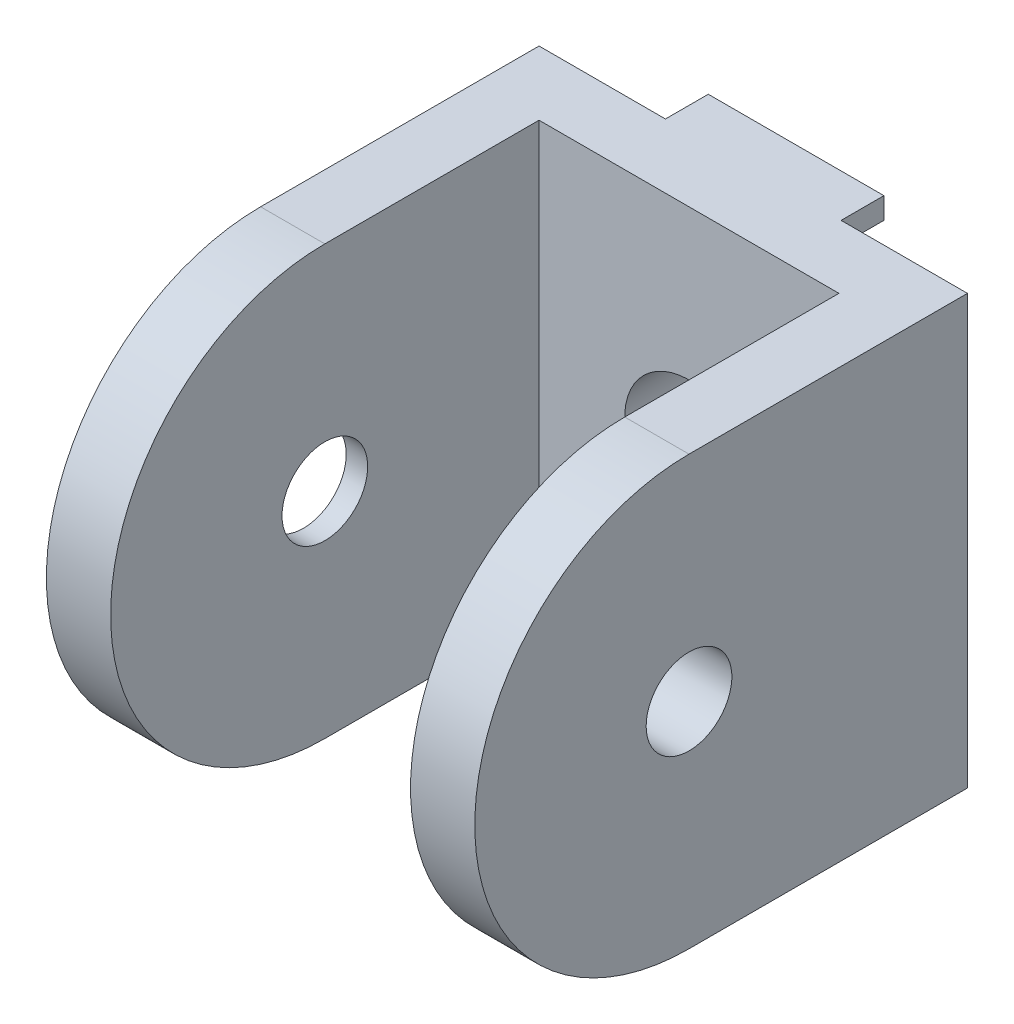
ISO-10303-21;
HEADER;
FILE_DESCRIPTION(('STEP AP214'),'2;1');
FILE_NAME('part.step','',(''),(''),'','','');
FILE_SCHEMA(('AUTOMOTIVE_DESIGN { 1 0 10303 214 1 1 1 1 }'));
ENDSEC;
DATA;
#1=APPLICATION_CONTEXT('core data for automotive mechanical design processes');
#2=APPLICATION_PROTOCOL_DEFINITION('international standard','automotive_design',2000,#1);
#3=PRODUCT_CONTEXT('',#1,'mechanical');
#4=PRODUCT('Part','Part','',(#3));
#5=PRODUCT_RELATED_PRODUCT_CATEGORY('part','',(#4));
#6=PRODUCT_DEFINITION_FORMATION('','',#4);
#7=PRODUCT_DEFINITION_CONTEXT('part definition',#1,'design');
#8=PRODUCT_DEFINITION('design','',#6,#7);
#9=PRODUCT_DEFINITION_SHAPE('','',#8);
#10=(LENGTH_UNIT() NAMED_UNIT(*) SI_UNIT(.MILLI.,.METRE.));
#11=(NAMED_UNIT(*) PLANE_ANGLE_UNIT() SI_UNIT($,.RADIAN.));
#12=(NAMED_UNIT(*) SI_UNIT($,.STERADIAN.) SOLID_ANGLE_UNIT());
#13=UNCERTAINTY_MEASURE_WITH_UNIT(LENGTH_MEASURE(1.E-05),#10,'distance_accuracy_value','');
#14=(GEOMETRIC_REPRESENTATION_CONTEXT(3) GLOBAL_UNCERTAINTY_ASSIGNED_CONTEXT((#13)) GLOBAL_UNIT_ASSIGNED_CONTEXT((#10,
#11,#12)) REPRESENTATION_CONTEXT('',''));
#15=CARTESIAN_POINT('',(0.,0.,0.));
#16=DIRECTION('',(0.,0.,1.));
#17=DIRECTION('',(1.,0.,0.));
#18=AXIS2_PLACEMENT_3D('',#15,#16,#17);
#19=CARTESIAN_POINT('',(10.,10.,0.));
#20=DIRECTION('',(0.,0.,-1.));
#21=DIRECTION('',(-1.,0.,0.));
#22=AXIS2_PLACEMENT_3D('',#19,#20,#21);
#23=PLANE('',#22);
#24=CARTESIAN_POINT('',(0.,0.,0.));
#25=DIRECTION('',(0.,0.,1.));
#26=DIRECTION('',(1.,0.,0.));
#27=AXIS2_PLACEMENT_3D('',#24,#25,#26);
#28=CIRCLE('',#27,3.);
#29=CARTESIAN_POINT('',(3.,0.,0.));
#30=VERTEX_POINT('',#29);
#31=EDGE_CURVE('E277',#30,#30,#28,.T.);
#32=ORIENTED_EDGE('',*,*,#31,.T.);
#33=EDGE_LOOP('',(#32));
#34=FACE_BOUND('',#33,.T.);
#35=DIRECTION('',(1.,0.,0.));
#36=VECTOR('',#35,1.);
#37=CARTESIAN_POINT('',(4.1,-9.,0.));
#38=LINE('',#37,#36);
#39=CARTESIAN_POINT('',(-4.1,-9.,0.));
#40=VERTEX_POINT('',#39);
#41=CARTESIAN_POINT('',(4.1,-9.,0.));
#42=VERTEX_POINT('',#41);
#43=EDGE_CURVE('E338',#40,#42,#38,.T.);
#44=ORIENTED_EDGE('',*,*,#43,.F.);
#45=DIRECTION('',(0.,1.,0.));
#46=VECTOR('',#45,1.);
#47=CARTESIAN_POINT('',(-4.1,-10.,0.));
#48=LINE('',#47,#46);
#49=CARTESIAN_POINT('',(-4.1,-10.,0.));
#50=VERTEX_POINT('',#49);
#51=EDGE_CURVE('E336',#50,#40,#48,.T.);
#52=ORIENTED_EDGE('',*,*,#51,.F.);
#53=DIRECTION('',(1.,0.,0.));
#54=VECTOR('',#53,1.);
#55=CARTESIAN_POINT('',(-10.,-10.,0.));
#56=LINE('',#55,#54);
#57=CARTESIAN_POINT('',(-10.,-10.,0.));
#58=VERTEX_POINT('',#57);
#59=EDGE_CURVE('E172',#58,#50,#56,.T.);
#60=ORIENTED_EDGE('',*,*,#59,.F.);
#61=DIRECTION('',(0.,-1.,0.));
#62=VECTOR('',#61,1.);
#63=CARTESIAN_POINT('',(-10.,-10.,0.));
#64=LINE('',#63,#62);
#65=CARTESIAN_POINT('',(-10.,10.,0.));
#66=VERTEX_POINT('',#65);
#67=EDGE_CURVE('E225',#66,#58,#64,.T.);
#68=ORIENTED_EDGE('',*,*,#67,.F.);
#69=DIRECTION('',(-1.,0.,0.));
#70=VECTOR('',#69,1.);
#71=CARTESIAN_POINT('',(-10.,10.,0.));
#72=LINE('',#71,#70);
#73=CARTESIAN_POINT('',(-4.1,10.,0.));
#74=VERTEX_POINT('',#73);
#75=EDGE_CURVE('E215',#74,#66,#72,.T.);
#76=ORIENTED_EDGE('',*,*,#75,.F.);
#77=DIRECTION('',(0.,1.,0.));
#78=VECTOR('',#77,1.);
#79=CARTESIAN_POINT('',(-4.1,10.,0.));
#80=LINE('',#79,#78);
#81=CARTESIAN_POINT('',(-4.1,9.,0.));
#82=VERTEX_POINT('',#81);
#83=EDGE_CURVE('E184',#82,#74,#80,.T.);
#84=ORIENTED_EDGE('',*,*,#83,.F.);
#85=DIRECTION('',(-1.,0.,0.));
#86=VECTOR('',#85,1.);
#87=CARTESIAN_POINT('',(4.1,9.,0.));
#88=LINE('',#87,#86);
#89=CARTESIAN_POINT('',(4.1,9.,0.));
#90=VERTEX_POINT('',#89);
#91=EDGE_CURVE('E58',#90,#82,#88,.T.);
#92=ORIENTED_EDGE('',*,*,#91,.F.);
#93=DIRECTION('',(0.,-1.,0.));
#94=VECTOR('',#93,1.);
#95=CARTESIAN_POINT('',(4.1,10.,0.));
#96=LINE('',#95,#94);
#97=CARTESIAN_POINT('',(4.1,10.,0.));
#98=VERTEX_POINT('',#97);
#99=EDGE_CURVE('E173',#98,#90,#96,.T.);
#100=ORIENTED_EDGE('',*,*,#99,.F.);
#101=CARTESIAN_POINT('',(10.,10.,0.));
#102=VERTEX_POINT('',#101);
#103=EDGE_CURVE('E218',#102,#98,#72,.T.);
#104=ORIENTED_EDGE('',*,*,#103,.F.);
#105=DIRECTION('',(0.,1.,0.));
#106=VECTOR('',#105,1.);
#107=CARTESIAN_POINT('',(10.,-10.,0.));
#108=LINE('',#107,#106);
#109=CARTESIAN_POINT('',(10.,-10.,0.));
#110=VERTEX_POINT('',#109);
#111=EDGE_CURVE('E219',#110,#102,#108,.T.);
#112=ORIENTED_EDGE('',*,*,#111,.F.);
#113=CARTESIAN_POINT('',(4.1,-10.,0.));
#114=VERTEX_POINT('',#113);
#115=EDGE_CURVE('E229',#114,#110,#56,.T.);
#116=ORIENTED_EDGE('',*,*,#115,.F.);
#117=DIRECTION('',(0.,-1.,0.));
#118=VECTOR('',#117,1.);
#119=CARTESIAN_POINT('',(4.1,-10.,0.));
#120=LINE('',#119,#118);
#121=EDGE_CURVE('E166',#42,#114,#120,.T.);
#122=ORIENTED_EDGE('',*,*,#121,.F.);
#123=EDGE_LOOP('',(#44,#52,#60,#68,#76,#84,#92,#100,#104,#112,#116,#122));
#124=FACE_BOUND('',#123,.T.);
#125=ADVANCED_FACE('F33',(#34,#124),#23,.T.);
#126=CARTESIAN_POINT('',(10.,0.,13.));
#127=DIRECTION('',(-1.,0.,0.));
#128=DIRECTION('',(0.,0.,1.));
#129=AXIS2_PLACEMENT_3D('',#126,#127,#128);
#130=CYLINDRICAL_SURFACE('',#129,2.);
#131=CARTESIAN_POINT('',(-7.,0.,13.));
#132=DIRECTION('',(-1.,0.,0.));
#133=DIRECTION('',(0.,0.,1.));
#134=AXIS2_PLACEMENT_3D('',#131,#132,#133);
#135=CIRCLE('',#134,2.);
#136=CARTESIAN_POINT('',(-7.,0.,15.));
#137=VERTEX_POINT('',#136);
#138=EDGE_CURVE('E262',#137,#137,#135,.T.);
#139=ORIENTED_EDGE('',*,*,#138,.F.);
#140=EDGE_LOOP('',(#139));
#141=FACE_BOUND('',#140,.T.);
#142=CARTESIAN_POINT('',(-8.,0.,13.));
#143=DIRECTION('',(-1.,0.,0.));
#144=DIRECTION('',(0.,0.,1.));
#145=AXIS2_PLACEMENT_3D('',#142,#143,#144);
#146=CIRCLE('',#145,2.);
#147=CARTESIAN_POINT('',(-8.,0.,15.));
#148=VERTEX_POINT('',#147);
#149=EDGE_CURVE('E264',#148,#148,#146,.F.);
#150=ORIENTED_EDGE('',*,*,#149,.F.);
#151=EDGE_LOOP('',(#150));
#152=FACE_BOUND('',#151,.T.);
#153=ADVANCED_FACE('F380',(#141,#152),#130,.F.);
#154=CARTESIAN_POINT('',(-10.,10.,3.));
#155=DIRECTION('',(0.,-1.,0.));
#156=DIRECTION('',(0.,0.,-1.));
#157=AXIS2_PLACEMENT_3D('',#154,#155,#156);
#158=PLANE('',#157);
#159=DIRECTION('',(1.,0.,0.));
#160=VECTOR('',#159,1.);
#161=CARTESIAN_POINT('',(-76.8194036266836,10.,13.));
#162=LINE('',#161,#160);
#163=CARTESIAN_POINT('',(7.00000000000001,10.,13.));
#164=VERTEX_POINT('',#163);
#165=CARTESIAN_POINT('',(9.99999999999994,10.,13.));
#166=VERTEX_POINT('',#165);
#167=EDGE_CURVE('E286',#164,#166,#162,.T.);
#168=ORIENTED_EDGE('',*,*,#167,.T.);
#169=DIRECTION('',(0.,0.,-1.));
#170=VECTOR('',#169,1.);
#171=CARTESIAN_POINT('',(10.,10.,3.));
#172=LINE('',#171,#170);
#173=EDGE_CURVE('E11',#166,#102,#172,.T.);
#174=ORIENTED_EDGE('',*,*,#173,.T.);
#175=ORIENTED_EDGE('',*,*,#103,.T.);
#176=DIRECTION('',(0.,0.,1.));
#177=VECTOR('',#176,1.);
#178=CARTESIAN_POINT('',(4.1,10.,-2.));
#179=LINE('',#178,#177);
#180=CARTESIAN_POINT('',(4.1,10.,-2.));
#181=VERTEX_POINT('',#180);
#182=EDGE_CURVE('E190',#181,#98,#179,.T.);
#183=ORIENTED_EDGE('',*,*,#182,.F.);
#184=DIRECTION('',(1.,0.,0.));
#185=VECTOR('',#184,1.);
#186=CARTESIAN_POINT('',(4.1,10.,-2.));
#187=LINE('',#186,#185);
#188=CARTESIAN_POINT('',(-4.1,10.,-2.));
#189=VERTEX_POINT('',#188);
#190=EDGE_CURVE('E188',#189,#181,#187,.T.);
#191=ORIENTED_EDGE('',*,*,#190,.F.);
#192=DIRECTION('',(0.,0.,1.));
#193=VECTOR('',#192,1.);
#194=CARTESIAN_POINT('',(-4.1,10.,-2.));
#195=LINE('',#194,#193);
#196=EDGE_CURVE('E201',#189,#74,#195,.T.);
#197=ORIENTED_EDGE('',*,*,#196,.T.);
#198=ORIENTED_EDGE('',*,*,#75,.T.);
#199=DIRECTION('',(0.,0.,-1.));
#200=VECTOR('',#199,1.);
#201=CARTESIAN_POINT('',(-10.,10.,3.));
#202=LINE('',#201,#200);
#203=CARTESIAN_POINT('',(-10.,10.,13.));
#204=VERTEX_POINT('',#203);
#205=EDGE_CURVE('E42',#204,#66,#202,.T.);
#206=ORIENTED_EDGE('',*,*,#205,.F.);
#207=CARTESIAN_POINT('',(-7.00000000000003,10.,13.));
#208=VERTEX_POINT('',#207);
#209=EDGE_CURVE('E289',#204,#208,#162,.T.);
#210=ORIENTED_EDGE('',*,*,#209,.T.);
#211=DIRECTION('',(0.,0.,-1.));
#212=VECTOR('',#211,1.);
#213=CARTESIAN_POINT('',(-7.,10.,23.));
#214=LINE('',#213,#212);
#215=CARTESIAN_POINT('',(-7.,10.,3.));
#216=VERTEX_POINT('',#215);
#217=EDGE_CURVE('E255',#208,#216,#214,.T.);
#218=ORIENTED_EDGE('',*,*,#217,.T.);
#219=DIRECTION('',(-1.,0.,0.));
#220=VECTOR('',#219,1.);
#221=CARTESIAN_POINT('',(-10.,10.,3.));
#222=LINE('',#221,#220);
#223=CARTESIAN_POINT('',(7.,10.,3.));
#224=VERTEX_POINT('',#223);
#225=EDGE_CURVE('E231',#224,#216,#222,.T.);
#226=ORIENTED_EDGE('',*,*,#225,.F.);
#227=DIRECTION('',(0.,0.,-1.));
#228=VECTOR('',#227,1.);
#229=CARTESIAN_POINT('',(7.,10.,23.));
#230=LINE('',#229,#228);
#231=EDGE_CURVE('E305',#164,#224,#230,.T.);
#232=ORIENTED_EDGE('',*,*,#231,.F.);
#233=EDGE_LOOP('',(#168,#174,#175,#183,#191,#197,#198,#206,#210,#218,#226,#232));
#234=FACE_BOUND('',#233,.T.);
#235=ADVANCED_FACE('F324',(#234),#158,.F.);
#236=CARTESIAN_POINT('',(10.,10.,3.));
#237=DIRECTION('',(0.,0.,-1.));
#238=DIRECTION('',(-1.,0.,0.));
#239=AXIS2_PLACEMENT_3D('',#236,#237,#238);
#240=PLANE('',#239);
#241=CARTESIAN_POINT('',(0.,0.,3.));
#242=DIRECTION('',(0.,0.,1.));
#243=DIRECTION('',(1.,0.,0.));
#244=AXIS2_PLACEMENT_3D('',#241,#242,#243);
#245=CIRCLE('',#244,3.);
#246=CARTESIAN_POINT('',(3.,0.,3.));
#247=VERTEX_POINT('',#246);
#248=EDGE_CURVE('E280',#247,#247,#245,.T.);
#249=ORIENTED_EDGE('',*,*,#248,.F.);
#250=EDGE_LOOP('',(#249));
#251=FACE_BOUND('',#250,.T.);
#252=DIRECTION('',(0.,-1.,0.));
#253=VECTOR('',#252,1.);
#254=CARTESIAN_POINT('',(7.,-10.,3.));
#255=LINE('',#254,#253);
#256=CARTESIAN_POINT('',(7.,-10.,3.));
#257=VERTEX_POINT('',#256);
#258=EDGE_CURVE('E301',#224,#257,#255,.T.);
#259=ORIENTED_EDGE('',*,*,#258,.F.);
#260=ORIENTED_EDGE('',*,*,#225,.T.);
#261=DIRECTION('',(0.,1.,0.));
#262=VECTOR('',#261,1.);
#263=CARTESIAN_POINT('',(-7.,-10.,3.));
#264=LINE('',#263,#262);
#265=CARTESIAN_POINT('',(-7.,-10.,3.));
#266=VERTEX_POINT('',#265);
#267=EDGE_CURVE('E242',#266,#216,#264,.T.);
#268=ORIENTED_EDGE('',*,*,#267,.F.);
#269=DIRECTION('',(1.,0.,0.));
#270=VECTOR('',#269,1.);
#271=CARTESIAN_POINT('',(-10.,-10.,3.));
#272=LINE('',#271,#270);
#273=EDGE_CURVE('E236',#266,#257,#272,.T.);
#274=ORIENTED_EDGE('',*,*,#273,.T.);
#275=EDGE_LOOP('',(#259,#260,#268,#274));
#276=FACE_BOUND('',#275,.T.);
#277=ADVANCED_FACE('F317',(#251,#276),#240,.F.);
#278=CARTESIAN_POINT('',(10.,-10.,3.));
#279=DIRECTION('',(-1.,0.,0.));
#280=DIRECTION('',(0.,0.,1.));
#281=AXIS2_PLACEMENT_3D('',#278,#279,#280);
#282=PLANE('',#281);
#283=CARTESIAN_POINT('',(10.,0.,13.));
#284=DIRECTION('',(-1.,0.,0.));
#285=DIRECTION('',(0.,0.,1.));
#286=AXIS2_PLACEMENT_3D('',#283,#284,#285);
#287=CIRCLE('',#286,2.);
#288=CARTESIAN_POINT('',(10.,0.,15.));
#289=VERTEX_POINT('',#288);
#290=EDGE_CURVE('E263',#289,#289,#287,.T.);
#291=ORIENTED_EDGE('',*,*,#290,.T.);
#292=EDGE_LOOP('',(#291));
#293=FACE_BOUND('',#292,.T.);
#294=CARTESIAN_POINT('',(9.99999999999999,0.,13.));
#295=DIRECTION('',(-1.,0.,0.));
#296=DIRECTION('',(0.,0.,1.));
#297=AXIS2_PLACEMENT_3D('',#294,#295,#296);
#298=CIRCLE('',#297,10.);
#299=CARTESIAN_POINT('',(9.99999999999994,-10.,13.));
#300=VERTEX_POINT('',#299);
#301=EDGE_CURVE('E296',#166,#300,#298,.F.);
#302=ORIENTED_EDGE('',*,*,#301,.T.);
#303=DIRECTION('',(0.,0.,-1.));
#304=VECTOR('',#303,1.);
#305=CARTESIAN_POINT('',(10.,-10.,3.));
#306=LINE('',#305,#304);
#307=EDGE_CURVE('E232',#300,#110,#306,.T.);
#308=ORIENTED_EDGE('',*,*,#307,.T.);
#309=ORIENTED_EDGE('',*,*,#111,.T.);
#310=ORIENTED_EDGE('',*,*,#173,.F.);
#311=EDGE_LOOP('',(#302,#308,#309,#310));
#312=FACE_BOUND('',#311,.T.);
#313=ADVANCED_FACE('F35',(#293,#312),#282,.F.);
#314=CARTESIAN_POINT('',(-10.,-10.,3.));
#315=DIRECTION('',(1.,0.,0.));
#316=DIRECTION('',(0.,0.,-1.));
#317=AXIS2_PLACEMENT_3D('',#314,#315,#316);
#318=PLANE('',#317);
#319=CARTESIAN_POINT('',(-10.,0.,13.));
#320=DIRECTION('',(-1.,0.,0.));
#321=DIRECTION('',(0.,0.,1.));
#322=AXIS2_PLACEMENT_3D('',#319,#320,#321);
#323=CIRCLE('',#322,5.);
#324=CARTESIAN_POINT('',(-10.,0.,18.));
#325=VERTEX_POINT('',#324);
#326=EDGE_CURVE('E272',#325,#325,#323,.T.);
#327=ORIENTED_EDGE('',*,*,#326,.F.);
#328=EDGE_LOOP('',(#327));
#329=FACE_BOUND('',#328,.T.);
#330=DIRECTION('',(0.,0.,-1.));
#331=VECTOR('',#330,1.);
#332=CARTESIAN_POINT('',(-10.,-10.,3.));
#333=LINE('',#332,#331);
#334=CARTESIAN_POINT('',(-10.,-10.,13.));
#335=VERTEX_POINT('',#334);
#336=EDGE_CURVE('E235',#335,#58,#333,.T.);
#337=ORIENTED_EDGE('',*,*,#336,.F.);
#338=CARTESIAN_POINT('',(-9.99999999999999,0.,13.));
#339=DIRECTION('',(1.,0.,0.));
#340=DIRECTION('',(0.,0.,-1.));
#341=AXIS2_PLACEMENT_3D('',#338,#339,#340);
#342=CIRCLE('',#341,10.);
#343=EDGE_CURVE('E299',#335,#204,#342,.F.);
#344=ORIENTED_EDGE('',*,*,#343,.T.);
#345=ORIENTED_EDGE('',*,*,#205,.T.);
#346=ORIENTED_EDGE('',*,*,#67,.T.);
#347=EDGE_LOOP('',(#337,#344,#345,#346));
#348=FACE_BOUND('',#347,.T.);
#349=ADVANCED_FACE('F333',(#329,#348),#318,.F.);
#350=CARTESIAN_POINT('',(-10.,-10.,3.));
#351=DIRECTION('',(0.,1.,0.));
#352=DIRECTION('',(0.,0.,1.));
#353=AXIS2_PLACEMENT_3D('',#350,#351,#352);
#354=PLANE('',#353);
#355=ORIENTED_EDGE('',*,*,#307,.F.);
#356=DIRECTION('',(1.,0.,0.));
#357=VECTOR('',#356,1.);
#358=CARTESIAN_POINT('',(-76.8194036266836,-10.,13.));
#359=LINE('',#358,#357);
#360=CARTESIAN_POINT('',(6.99999999999998,-10.,13.));
#361=VERTEX_POINT('',#360);
#362=EDGE_CURVE('E285',#361,#300,#359,.T.);
#363=ORIENTED_EDGE('',*,*,#362,.F.);
#364=DIRECTION('',(0.,0.,-1.));
#365=VECTOR('',#364,1.);
#366=CARTESIAN_POINT('',(7.,-10.,23.));
#367=LINE('',#366,#365);
#368=EDGE_CURVE('E304',#361,#257,#367,.T.);
#369=ORIENTED_EDGE('',*,*,#368,.T.);
#370=ORIENTED_EDGE('',*,*,#273,.F.);
#371=DIRECTION('',(0.,0.,-1.));
#372=VECTOR('',#371,1.);
#373=CARTESIAN_POINT('',(-7.,-10.,23.));
#374=LINE('',#373,#372);
#375=CARTESIAN_POINT('',(-7.00000000000003,-10.,13.));
#376=VERTEX_POINT('',#375);
#377=EDGE_CURVE('E257',#376,#266,#374,.T.);
#378=ORIENTED_EDGE('',*,*,#377,.F.);
#379=EDGE_CURVE('E290',#335,#376,#359,.T.);
#380=ORIENTED_EDGE('',*,*,#379,.F.);
#381=ORIENTED_EDGE('',*,*,#336,.T.);
#382=ORIENTED_EDGE('',*,*,#59,.T.);
#383=DIRECTION('',(0.,0.,1.));
#384=VECTOR('',#383,1.);
#385=CARTESIAN_POINT('',(-4.1,-10.,-2.));
#386=LINE('',#385,#384);
#387=CARTESIAN_POINT('',(-4.1,-10.,-2.));
#388=VERTEX_POINT('',#387);
#389=EDGE_CURVE('E151',#388,#50,#386,.T.);
#390=ORIENTED_EDGE('',*,*,#389,.F.);
#391=DIRECTION('',(-1.,0.,0.));
#392=VECTOR('',#391,1.);
#393=CARTESIAN_POINT('',(4.1,-10.,-2.));
#394=LINE('',#393,#392);
#395=CARTESIAN_POINT('',(4.1,-10.,-2.));
#396=VERTEX_POINT('',#395);
#397=EDGE_CURVE('E158',#396,#388,#394,.T.);
#398=ORIENTED_EDGE('',*,*,#397,.F.);
#399=DIRECTION('',(0.,0.,1.));
#400=VECTOR('',#399,1.);
#401=CARTESIAN_POINT('',(4.1,-10.,-2.));
#402=LINE('',#401,#400);
#403=EDGE_CURVE('E345',#396,#114,#402,.T.);
#404=ORIENTED_EDGE('',*,*,#403,.T.);
#405=ORIENTED_EDGE('',*,*,#115,.T.);
#406=EDGE_LOOP('',(#355,#363,#369,#370,#378,#380,#381,#382,#390,#398,#404,#405));
#407=FACE_BOUND('',#406,.T.);
#408=ADVANCED_FACE('F170',(#407),#354,.F.);
#409=CARTESIAN_POINT('',(-7.,-10.,23.));
#410=DIRECTION('',(-1.,0.,0.));
#411=DIRECTION('',(0.,0.,1.));
#412=AXIS2_PLACEMENT_3D('',#409,#410,#411);
#413=PLANE('',#412);
#414=ORIENTED_EDGE('',*,*,#138,.T.);
#415=EDGE_LOOP('',(#414));
#416=FACE_BOUND('',#415,.T.);
#417=CARTESIAN_POINT('',(-7.00000000000001,0.,13.));
#418=DIRECTION('',(-1.,0.,0.));
#419=DIRECTION('',(0.,0.,1.));
#420=AXIS2_PLACEMENT_3D('',#417,#418,#419);
#421=CIRCLE('',#420,10.);
#422=EDGE_CURVE('E295',#208,#376,#421,.F.);
#423=ORIENTED_EDGE('',*,*,#422,.T.);
#424=ORIENTED_EDGE('',*,*,#377,.T.);
#425=ORIENTED_EDGE('',*,*,#267,.T.);
#426=ORIENTED_EDGE('',*,*,#217,.F.);
#427=EDGE_LOOP('',(#423,#424,#425,#426));
#428=FACE_BOUND('',#427,.T.);
#429=ADVANCED_FACE('F313',(#416,#428),#413,.F.);
#430=CARTESIAN_POINT('',(7.,-10.,23.));
#431=DIRECTION('',(1.,0.,0.));
#432=DIRECTION('',(0.,0.,-1.));
#433=AXIS2_PLACEMENT_3D('',#430,#431,#432);
#434=PLANE('',#433);
#435=CARTESIAN_POINT('',(7.,0.,13.));
#436=DIRECTION('',(1.,0.,0.));
#437=DIRECTION('',(0.,0.,-1.));
#438=AXIS2_PLACEMENT_3D('',#435,#436,#437);
#439=CIRCLE('',#438,2.);
#440=CARTESIAN_POINT('',(7.,0.,11.));
#441=VERTEX_POINT('',#440);
#442=EDGE_CURVE('E260',#441,#441,#439,.T.);
#443=ORIENTED_EDGE('',*,*,#442,.T.);
#444=EDGE_LOOP('',(#443));
#445=FACE_BOUND('',#444,.T.);
#446=ORIENTED_EDGE('',*,*,#368,.F.);
#447=CARTESIAN_POINT('',(7.00000000000001,0.,13.));
#448=DIRECTION('',(1.,0.,0.));
#449=DIRECTION('',(0.,0.,-1.));
#450=AXIS2_PLACEMENT_3D('',#447,#448,#449);
#451=CIRCLE('',#450,10.);
#452=EDGE_CURVE('E293',#361,#164,#451,.F.);
#453=ORIENTED_EDGE('',*,*,#452,.T.);
#454=ORIENTED_EDGE('',*,*,#231,.T.);
#455=ORIENTED_EDGE('',*,*,#258,.T.);
#456=EDGE_LOOP('',(#446,#453,#454,#455));
#457=FACE_BOUND('',#456,.T.);
#458=ADVANCED_FACE('F322',(#445,#457),#434,.F.);
#459=CARTESIAN_POINT('',(-76.8194036266836,0.,13.));
#460=DIRECTION('',(1.,0.,0.));
#461=DIRECTION('',(0.,0.,-1.));
#462=AXIS2_PLACEMENT_3D('',#459,#460,#461);
#463=CYLINDRICAL_SURFACE('',#462,10.);
#464=ORIENTED_EDGE('',*,*,#362,.T.);
#465=ORIENTED_EDGE('',*,*,#301,.F.);
#466=ORIENTED_EDGE('',*,*,#167,.F.);
#467=ORIENTED_EDGE('',*,*,#452,.F.);
#468=EDGE_LOOP('',(#464,#465,#466,#467));
#469=FACE_BOUND('',#468,.T.);
#470=ADVANCED_FACE('F356',(#469),#463,.T.);
#471=ORIENTED_EDGE('',*,*,#343,.F.);
#472=ORIENTED_EDGE('',*,*,#379,.T.);
#473=ORIENTED_EDGE('',*,*,#422,.F.);
#474=ORIENTED_EDGE('',*,*,#209,.F.);
#475=EDGE_LOOP('',(#471,#472,#473,#474));
#476=FACE_BOUND('',#475,.T.);
#477=ADVANCED_FACE('F329',(#476),#463,.T.);
#478=ORIENTED_EDGE('',*,*,#290,.F.);
#479=EDGE_LOOP('',(#478));
#480=FACE_BOUND('',#479,.T.);
#481=ORIENTED_EDGE('',*,*,#442,.F.);
#482=EDGE_LOOP('',(#481));
#483=FACE_BOUND('',#482,.T.);
#484=ADVANCED_FACE('F389',(#480,#483),#130,.F.);
#485=CARTESIAN_POINT('',(-8.,0.,13.));
#486=DIRECTION('',(-1.,0.,0.));
#487=DIRECTION('',(0.,0.,1.));
#488=AXIS2_PLACEMENT_3D('',#485,#486,#487);
#489=PLANE('',#488);
#490=CARTESIAN_POINT('',(-8.,0.,13.));
#491=DIRECTION('',(-1.,0.,0.));
#492=DIRECTION('',(0.,0.,1.));
#493=AXIS2_PLACEMENT_3D('',#490,#491,#492);
#494=CIRCLE('',#493,5.);
#495=CARTESIAN_POINT('',(-8.,0.,18.));
#496=VERTEX_POINT('',#495);
#497=EDGE_CURVE('E266',#496,#496,#494,.T.);
#498=ORIENTED_EDGE('',*,*,#497,.T.);
#499=EDGE_LOOP('',(#498));
#500=FACE_BOUND('',#499,.T.);
#501=ORIENTED_EDGE('',*,*,#149,.T.);
#502=EDGE_LOOP('',(#501));
#503=FACE_BOUND('',#502,.T.);
#504=ADVANCED_FACE('F400',(#500,#503),#489,.T.);
#505=CARTESIAN_POINT('',(-8.,0.,13.));
#506=DIRECTION('',(-1.,0.,0.));
#507=DIRECTION('',(0.,0.,1.));
#508=AXIS2_PLACEMENT_3D('',#505,#506,#507);
#509=CYLINDRICAL_SURFACE('',#508,5.);
#510=ORIENTED_EDGE('',*,*,#497,.F.);
#511=EDGE_LOOP('',(#510));
#512=FACE_BOUND('',#511,.T.);
#513=ORIENTED_EDGE('',*,*,#326,.T.);
#514=EDGE_LOOP('',(#513));
#515=FACE_BOUND('',#514,.T.);
#516=ADVANCED_FACE('F369',(#512,#515),#509,.F.);
#517=CARTESIAN_POINT('',(0.,0.,0.));
#518=DIRECTION('',(0.,0.,1.));
#519=DIRECTION('',(1.,0.,0.));
#520=AXIS2_PLACEMENT_3D('',#517,#518,#519);
#521=CYLINDRICAL_SURFACE('',#520,3.);
#522=ORIENTED_EDGE('',*,*,#31,.F.);
#523=EDGE_LOOP('',(#522));
#524=FACE_BOUND('',#523,.T.);
#525=ORIENTED_EDGE('',*,*,#248,.T.);
#526=EDGE_LOOP('',(#525));
#527=FACE_BOUND('',#526,.T.);
#528=ADVANCED_FACE('F366',(#524,#527),#521,.F.);
#529=CARTESIAN_POINT('',(4.1,10.,-2.));
#530=DIRECTION('',(-1.,0.,0.));
#531=DIRECTION('',(0.,0.,1.));
#532=AXIS2_PLACEMENT_3D('',#529,#530,#531);
#533=PLANE('',#532);
#534=ORIENTED_EDGE('',*,*,#99,.T.);
#535=DIRECTION('',(0.,0.,1.));
#536=VECTOR('',#535,1.);
#537=CARTESIAN_POINT('',(4.1,9.,-2.));
#538=LINE('',#537,#536);
#539=CARTESIAN_POINT('',(4.1,9.,-2.));
#540=VERTEX_POINT('',#539);
#541=EDGE_CURVE('E207',#540,#90,#538,.T.);
#542=ORIENTED_EDGE('',*,*,#541,.F.);
#543=DIRECTION('',(0.,-1.,0.));
#544=VECTOR('',#543,1.);
#545=CARTESIAN_POINT('',(4.1,10.,-2.));
#546=LINE('',#545,#544);
#547=EDGE_CURVE('E180',#181,#540,#546,.T.);
#548=ORIENTED_EDGE('',*,*,#547,.F.);
#549=ORIENTED_EDGE('',*,*,#182,.T.);
#550=EDGE_LOOP('',(#534,#542,#548,#549));
#551=FACE_BOUND('',#550,.T.);
#552=ADVANCED_FACE('F359',(#551),#533,.F.);
#553=CARTESIAN_POINT('',(4.1,9.,-2.));
#554=DIRECTION('',(0.,1.,0.));
#555=DIRECTION('',(0.,0.,1.));
#556=AXIS2_PLACEMENT_3D('',#553,#554,#555);
#557=PLANE('',#556);
#558=ORIENTED_EDGE('',*,*,#91,.T.);
#559=DIRECTION('',(0.,0.,1.));
#560=VECTOR('',#559,1.);
#561=CARTESIAN_POINT('',(-4.1,9.,-2.));
#562=LINE('',#561,#560);
#563=CARTESIAN_POINT('',(-4.1,9.,-2.));
#564=VERTEX_POINT('',#563);
#565=EDGE_CURVE('E194',#564,#82,#562,.T.);
#566=ORIENTED_EDGE('',*,*,#565,.F.);
#567=DIRECTION('',(-1.,0.,0.));
#568=VECTOR('',#567,1.);
#569=CARTESIAN_POINT('',(4.1,9.,-2.));
#570=LINE('',#569,#568);
#571=EDGE_CURVE('E183',#540,#564,#570,.T.);
#572=ORIENTED_EDGE('',*,*,#571,.F.);
#573=ORIENTED_EDGE('',*,*,#541,.T.);
#574=EDGE_LOOP('',(#558,#566,#572,#573));
#575=FACE_BOUND('',#574,.T.);
#576=ADVANCED_FACE('F489',(#575),#557,.F.);
#577=CARTESIAN_POINT('',(-4.1,10.,-2.));
#578=DIRECTION('',(1.,0.,0.));
#579=DIRECTION('',(0.,0.,-1.));
#580=AXIS2_PLACEMENT_3D('',#577,#578,#579);
#581=PLANE('',#580);
#582=ORIENTED_EDGE('',*,*,#83,.T.);
#583=ORIENTED_EDGE('',*,*,#196,.F.);
#584=DIRECTION('',(0.,1.,0.));
#585=VECTOR('',#584,1.);
#586=CARTESIAN_POINT('',(-4.1,10.,-2.));
#587=LINE('',#586,#585);
#588=EDGE_CURVE('E186',#564,#189,#587,.T.);
#589=ORIENTED_EDGE('',*,*,#588,.F.);
#590=ORIENTED_EDGE('',*,*,#565,.T.);
#591=EDGE_LOOP('',(#582,#583,#589,#590));
#592=FACE_BOUND('',#591,.T.);
#593=ADVANCED_FACE('F498',(#592),#581,.F.);
#594=CARTESIAN_POINT('',(4.1,9.,-2.));
#595=DIRECTION('',(0.,0.,-1.));
#596=DIRECTION('',(-1.,0.,0.));
#597=AXIS2_PLACEMENT_3D('',#594,#595,#596);
#598=PLANE('',#597);
#599=ORIENTED_EDGE('',*,*,#547,.T.);
#600=ORIENTED_EDGE('',*,*,#571,.T.);
#601=ORIENTED_EDGE('',*,*,#588,.T.);
#602=ORIENTED_EDGE('',*,*,#190,.T.);
#603=EDGE_LOOP('',(#599,#600,#601,#602));
#604=FACE_BOUND('',#603,.T.);
#605=ADVANCED_FACE('F507',(#604),#598,.T.);
#606=CARTESIAN_POINT('',(-4.1,-10.,-2.));
#607=DIRECTION('',(1.,0.,0.));
#608=DIRECTION('',(0.,0.,-1.));
#609=AXIS2_PLACEMENT_3D('',#606,#607,#608);
#610=PLANE('',#609);
#611=ORIENTED_EDGE('',*,*,#51,.T.);
#612=DIRECTION('',(0.,0.,1.));
#613=VECTOR('',#612,1.);
#614=CARTESIAN_POINT('',(-4.1,-9.,-2.));
#615=LINE('',#614,#613);
#616=CARTESIAN_POINT('',(-4.1,-9.,-2.));
#617=VERTEX_POINT('',#616);
#618=EDGE_CURVE('E154',#617,#40,#615,.T.);
#619=ORIENTED_EDGE('',*,*,#618,.F.);
#620=DIRECTION('',(0.,1.,0.));
#621=VECTOR('',#620,1.);
#622=CARTESIAN_POINT('',(-4.1,-10.,-2.));
#623=LINE('',#622,#621);
#624=EDGE_CURVE('E147',#388,#617,#623,.T.);
#625=ORIENTED_EDGE('',*,*,#624,.F.);
#626=ORIENTED_EDGE('',*,*,#389,.T.);
#627=EDGE_LOOP('',(#611,#619,#625,#626));
#628=FACE_BOUND('',#627,.T.);
#629=ADVANCED_FACE('F149',(#628),#610,.F.);
#630=CARTESIAN_POINT('',(4.1,-9.,-2.));
#631=DIRECTION('',(0.,-1.,0.));
#632=DIRECTION('',(0.,0.,-1.));
#633=AXIS2_PLACEMENT_3D('',#630,#631,#632);
#634=PLANE('',#633);
#635=ORIENTED_EDGE('',*,*,#43,.T.);
#636=DIRECTION('',(0.,0.,1.));
#637=VECTOR('',#636,1.);
#638=CARTESIAN_POINT('',(4.1,-9.,-2.));
#639=LINE('',#638,#637);
#640=CARTESIAN_POINT('',(4.1,-9.,-2.));
#641=VERTEX_POINT('',#640);
#642=EDGE_CURVE('E50',#641,#42,#639,.T.);
#643=ORIENTED_EDGE('',*,*,#642,.F.);
#644=DIRECTION('',(1.,0.,0.));
#645=VECTOR('',#644,1.);
#646=CARTESIAN_POINT('',(4.1,-9.,-2.));
#647=LINE('',#646,#645);
#648=EDGE_CURVE('E157',#617,#641,#647,.T.);
#649=ORIENTED_EDGE('',*,*,#648,.F.);
#650=ORIENTED_EDGE('',*,*,#618,.T.);
#651=EDGE_LOOP('',(#635,#643,#649,#650));
#652=FACE_BOUND('',#651,.T.);
#653=ADVANCED_FACE('F348',(#652),#634,.F.);
#654=CARTESIAN_POINT('',(4.1,-10.,-2.));
#655=DIRECTION('',(-1.,0.,0.));
#656=DIRECTION('',(0.,0.,1.));
#657=AXIS2_PLACEMENT_3D('',#654,#655,#656);
#658=PLANE('',#657);
#659=ORIENTED_EDGE('',*,*,#121,.T.);
#660=ORIENTED_EDGE('',*,*,#403,.F.);
#661=DIRECTION('',(0.,-1.,0.));
#662=VECTOR('',#661,1.);
#663=CARTESIAN_POINT('',(4.1,-10.,-2.));
#664=LINE('',#663,#662);
#665=EDGE_CURVE('E162',#641,#396,#664,.T.);
#666=ORIENTED_EDGE('',*,*,#665,.F.);
#667=ORIENTED_EDGE('',*,*,#642,.T.);
#668=EDGE_LOOP('',(#659,#660,#666,#667));
#669=FACE_BOUND('',#668,.T.);
#670=ADVANCED_FACE('F349',(#669),#658,.F.);
#671=CARTESIAN_POINT('',(-4.1,-10.,-2.));
#672=DIRECTION('',(0.,0.,-1.));
#673=DIRECTION('',(-1.,0.,0.));
#674=AXIS2_PLACEMENT_3D('',#671,#672,#673);
#675=PLANE('',#674);
#676=ORIENTED_EDGE('',*,*,#397,.T.);
#677=ORIENTED_EDGE('',*,*,#624,.T.);
#678=ORIENTED_EDGE('',*,*,#648,.T.);
#679=ORIENTED_EDGE('',*,*,#665,.T.);
#680=EDGE_LOOP('',(#676,#677,#678,#679));
#681=FACE_BOUND('',#680,.T.);
#682=ADVANCED_FACE('F161',(#681),#675,.T.);
#683=CLOSED_SHELL('',(#125,#153,#235,#277,#313,#349,#408,#429,#458,#470,#477,#484,#504,#516,
#528,#552,#576,#593,#605,#629,#653,#670,#682));
#684=MANIFOLD_SOLID_BREP('B2',#683);
#685=ADVANCED_BREP_SHAPE_REPRESENTATION('',(#18,#684),#14);
#686=SHAPE_DEFINITION_REPRESENTATION(#9,#685);
ENDSEC;
END-ISO-10303-21;
